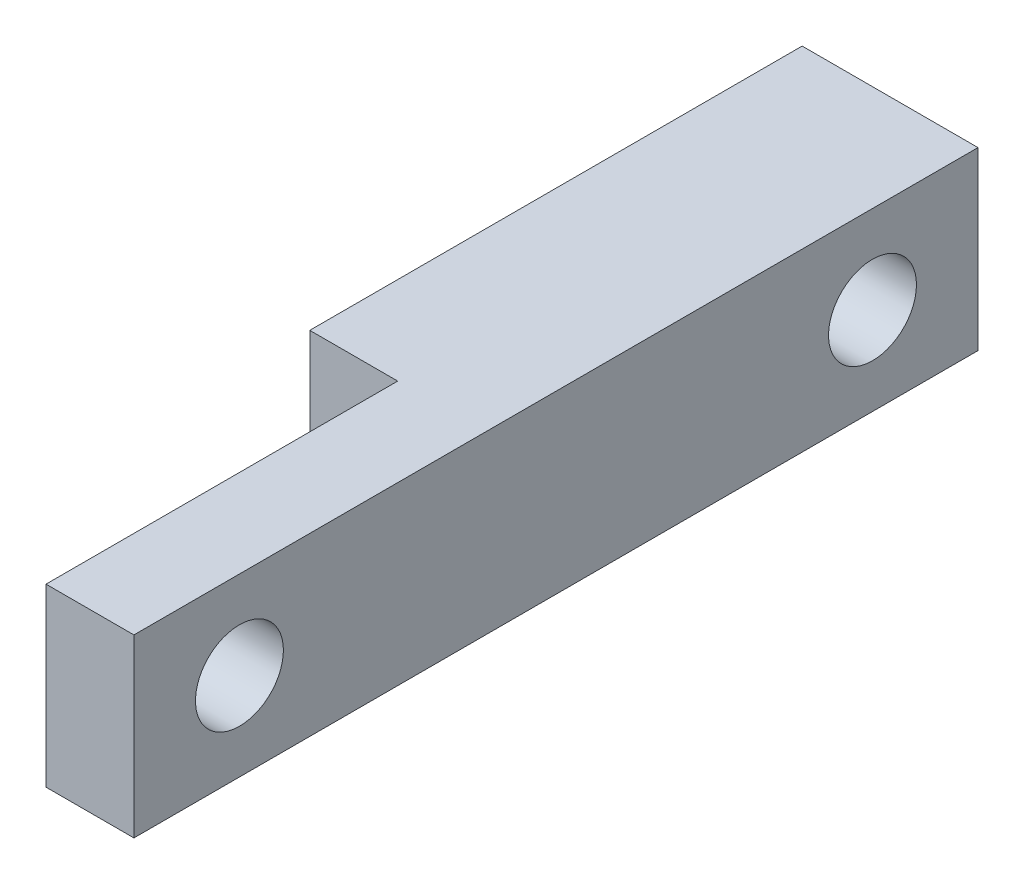
ISO-10303-21;
HEADER;
FILE_DESCRIPTION(('STEP AP214'),'2;1');
FILE_NAME('part.step','',(''),(''),'','','');
FILE_SCHEMA(('AUTOMOTIVE_DESIGN { 1 0 10303 214 1 1 1 1 }'));
ENDSEC;
DATA;
#1=APPLICATION_CONTEXT('core data for automotive mechanical design processes');
#2=APPLICATION_PROTOCOL_DEFINITION('international standard','automotive_design',2000,#1);
#3=PRODUCT_CONTEXT('',#1,'mechanical');
#4=PRODUCT('Part','Part','',(#3));
#5=PRODUCT_RELATED_PRODUCT_CATEGORY('part','',(#4));
#6=PRODUCT_DEFINITION_FORMATION('','',#4);
#7=PRODUCT_DEFINITION_CONTEXT('part definition',#1,'design');
#8=PRODUCT_DEFINITION('design','',#6,#7);
#9=PRODUCT_DEFINITION_SHAPE('','',#8);
#10=(LENGTH_UNIT() NAMED_UNIT(*) SI_UNIT(.MILLI.,.METRE.));
#11=(NAMED_UNIT(*) PLANE_ANGLE_UNIT() SI_UNIT($,.RADIAN.));
#12=(NAMED_UNIT(*) SI_UNIT($,.STERADIAN.) SOLID_ANGLE_UNIT());
#13=UNCERTAINTY_MEASURE_WITH_UNIT(LENGTH_MEASURE(1.E-05),#10,'distance_accuracy_value','');
#14=(GEOMETRIC_REPRESENTATION_CONTEXT(3) GLOBAL_UNCERTAINTY_ASSIGNED_CONTEXT((#13)) GLOBAL_UNIT_ASSIGNED_CONTEXT((#10,
#11,#12)) REPRESENTATION_CONTEXT('',''));
#15=CARTESIAN_POINT('',(0.,0.,0.));
#16=DIRECTION('',(0.,0.,1.));
#17=DIRECTION('',(1.,0.,0.));
#18=AXIS2_PLACEMENT_3D('',#15,#16,#17);
#19=CARTESIAN_POINT('',(6.35,0.,0.));
#20=DIRECTION('',(0.,0.,-1.));
#21=DIRECTION('',(-1.,0.,0.));
#22=AXIS2_PLACEMENT_3D('',#19,#20,#21);
#23=PLANE('',#22);
#24=DIRECTION('',(-1.,0.,0.));
#25=VECTOR('',#24,1.);
#26=CARTESIAN_POINT('',(6.35,6.35,0.));
#27=LINE('',#26,#25);
#28=CARTESIAN_POINT('',(6.35,6.35,0.));
#29=VERTEX_POINT('',#28);
#30=CARTESIAN_POINT('',(3.175,6.35,0.));
#31=VERTEX_POINT('',#30);
#32=EDGE_CURVE('E112',#29,#31,#27,.T.);
#33=ORIENTED_EDGE('',*,*,#32,.T.);
#34=DIRECTION('',(0.,1.,0.));
#35=VECTOR('',#34,1.);
#36=CARTESIAN_POINT('',(3.175,6.35,0.));
#37=LINE('',#36,#35);
#38=CARTESIAN_POINT('',(3.175,0.,0.));
#39=VERTEX_POINT('',#38);
#40=EDGE_CURVE('E96',#39,#31,#37,.T.);
#41=ORIENTED_EDGE('',*,*,#40,.F.);
#42=DIRECTION('',(-1.,0.,0.));
#43=VECTOR('',#42,1.);
#44=CARTESIAN_POINT('',(6.35,0.,0.));
#45=LINE('',#44,#43);
#46=CARTESIAN_POINT('',(6.35,0.,0.));
#47=VERTEX_POINT('',#46);
#48=EDGE_CURVE('E11',#47,#39,#45,.T.);
#49=ORIENTED_EDGE('',*,*,#48,.F.);
#50=DIRECTION('',(0.,-1.,0.));
#51=VECTOR('',#50,1.);
#52=CARTESIAN_POINT('',(6.35,0.,0.));
#53=LINE('',#52,#51);
#54=EDGE_CURVE('E116',#29,#47,#53,.T.);
#55=ORIENTED_EDGE('',*,*,#54,.F.);
#56=EDGE_LOOP('',(#33,#41,#49,#55));
#57=FACE_BOUND('',#56,.T.);
#58=ADVANCED_FACE('F33',(#57),#23,.F.);
#59=CARTESIAN_POINT('',(6.35,0.,0.));
#60=DIRECTION('',(0.,1.,0.));
#61=DIRECTION('',(0.,0.,1.));
#62=AXIS2_PLACEMENT_3D('',#59,#60,#61);
#63=PLANE('',#62);
#64=DIRECTION('',(0.,0.,1.));
#65=VECTOR('',#64,1.);
#66=CARTESIAN_POINT('',(3.175,0.,0.));
#67=LINE('',#66,#65);
#68=CARTESIAN_POINT('',(3.175,0.,-12.7));
#69=VERTEX_POINT('',#68);
#70=EDGE_CURVE('E103',#69,#39,#67,.T.);
#71=ORIENTED_EDGE('',*,*,#70,.F.);
#72=DIRECTION('',(-1.,0.,0.));
#73=VECTOR('',#72,1.);
#74=CARTESIAN_POINT('',(3.175,0.,-12.7));
#75=LINE('',#74,#73);
#76=CARTESIAN_POINT('',(0.,0.,-12.7));
#77=VERTEX_POINT('',#76);
#78=EDGE_CURVE('E142',#69,#77,#75,.T.);
#79=ORIENTED_EDGE('',*,*,#78,.T.);
#80=DIRECTION('',(0.,0.,-1.));
#81=VECTOR('',#80,1.);
#82=CARTESIAN_POINT('',(0.,0.,0.));
#83=LINE('',#82,#81);
#84=CARTESIAN_POINT('',(0.,0.,-30.48));
#85=VERTEX_POINT('',#84);
#86=EDGE_CURVE('E132',#77,#85,#83,.T.);
#87=ORIENTED_EDGE('',*,*,#86,.T.);
#88=DIRECTION('',(-1.,0.,0.));
#89=VECTOR('',#88,1.);
#90=CARTESIAN_POINT('',(6.35,0.,-30.48));
#91=LINE('',#90,#89);
#92=CARTESIAN_POINT('',(6.35,0.,-30.48));
#93=VERTEX_POINT('',#92);
#94=EDGE_CURVE('E41',#93,#85,#91,.T.);
#95=ORIENTED_EDGE('',*,*,#94,.F.);
#96=DIRECTION('',(0.,0.,-1.));
#97=VECTOR('',#96,1.);
#98=CARTESIAN_POINT('',(6.35,0.,0.));
#99=LINE('',#98,#97);
#100=EDGE_CURVE('E80',#47,#93,#99,.T.);
#101=ORIENTED_EDGE('',*,*,#100,.F.);
#102=ORIENTED_EDGE('',*,*,#48,.T.);
#103=EDGE_LOOP('',(#71,#79,#87,#95,#101,#102));
#104=FACE_BOUND('',#103,.T.);
#105=ADVANCED_FACE('F162',(#104),#63,.F.);
#106=CARTESIAN_POINT('',(6.35,0.,-30.48));
#107=DIRECTION('',(0.,0.,1.));
#108=DIRECTION('',(1.,0.,0.));
#109=AXIS2_PLACEMENT_3D('',#106,#107,#108);
#110=PLANE('',#109);
#111=DIRECTION('',(0.,1.,0.));
#112=VECTOR('',#111,1.);
#113=CARTESIAN_POINT('',(0.,0.,-30.48));
#114=LINE('',#113,#112);
#115=CARTESIAN_POINT('',(0.,6.35,-30.48));
#116=VERTEX_POINT('',#115);
#117=EDGE_CURVE('E73',#85,#116,#114,.T.);
#118=ORIENTED_EDGE('',*,*,#117,.T.);
#119=DIRECTION('',(-1.,0.,0.));
#120=VECTOR('',#119,1.);
#121=CARTESIAN_POINT('',(6.35,6.35,-30.48));
#122=LINE('',#121,#120);
#123=CARTESIAN_POINT('',(6.35,6.35,-30.48));
#124=VERTEX_POINT('',#123);
#125=EDGE_CURVE('E117',#124,#116,#122,.T.);
#126=ORIENTED_EDGE('',*,*,#125,.F.);
#127=DIRECTION('',(0.,1.,0.));
#128=VECTOR('',#127,1.);
#129=CARTESIAN_POINT('',(6.35,0.,-30.48));
#130=LINE('',#129,#128);
#131=EDGE_CURVE('E120',#93,#124,#130,.T.);
#132=ORIENTED_EDGE('',*,*,#131,.F.);
#133=ORIENTED_EDGE('',*,*,#94,.T.);
#134=EDGE_LOOP('',(#118,#126,#132,#133));
#135=FACE_BOUND('',#134,.T.);
#136=ADVANCED_FACE('F127',(#135),#110,.F.);
#137=CARTESIAN_POINT('',(6.35,6.35,0.));
#138=DIRECTION('',(0.,-1.,0.));
#139=DIRECTION('',(0.,0.,-1.));
#140=AXIS2_PLACEMENT_3D('',#137,#138,#139);
#141=PLANE('',#140);
#142=DIRECTION('',(0.,0.,1.));
#143=VECTOR('',#142,1.);
#144=CARTESIAN_POINT('',(0.,6.35,0.));
#145=LINE('',#144,#143);
#146=CARTESIAN_POINT('',(0.,6.35,-12.7));
#147=VERTEX_POINT('',#146);
#148=EDGE_CURVE('E123',#116,#147,#145,.T.);
#149=ORIENTED_EDGE('',*,*,#148,.T.);
#150=DIRECTION('',(-1.,0.,0.));
#151=VECTOR('',#150,1.);
#152=CARTESIAN_POINT('',(3.175,6.35,-12.7));
#153=LINE('',#152,#151);
#154=CARTESIAN_POINT('',(3.175,6.35,-12.7));
#155=VERTEX_POINT('',#154);
#156=EDGE_CURVE('E48',#155,#147,#153,.T.);
#157=ORIENTED_EDGE('',*,*,#156,.F.);
#158=DIRECTION('',(0.,0.,-1.));
#159=VECTOR('',#158,1.);
#160=CARTESIAN_POINT('',(3.175,6.35,0.));
#161=LINE('',#160,#159);
#162=EDGE_CURVE('E101',#31,#155,#161,.T.);
#163=ORIENTED_EDGE('',*,*,#162,.F.);
#164=ORIENTED_EDGE('',*,*,#32,.F.);
#165=DIRECTION('',(0.,0.,1.));
#166=VECTOR('',#165,1.);
#167=CARTESIAN_POINT('',(6.35,6.35,0.));
#168=LINE('',#167,#166);
#169=EDGE_CURVE('E57',#124,#29,#168,.T.);
#170=ORIENTED_EDGE('',*,*,#169,.F.);
#171=ORIENTED_EDGE('',*,*,#125,.T.);
#172=EDGE_LOOP('',(#149,#157,#163,#164,#170,#171));
#173=FACE_BOUND('',#172,.T.);
#174=ADVANCED_FACE('F111',(#173),#141,.F.);
#175=CARTESIAN_POINT('',(6.35,0.,0.));
#176=DIRECTION('',(-1.,0.,0.));
#177=DIRECTION('',(0.,0.,1.));
#178=AXIS2_PLACEMENT_3D('',#175,#176,#177);
#179=PLANE('',#178);
#180=CARTESIAN_POINT('',(6.35,3.175,-26.67));
#181=DIRECTION('',(1.,0.,0.));
#182=DIRECTION('',(0.,0.,-1.));
#183=AXIS2_PLACEMENT_3D('',#180,#181,#182);
#184=CIRCLE('',#183,1.58749999999999);
#185=CARTESIAN_POINT('',(6.35,3.175,-28.2575));
#186=VERTEX_POINT('',#185);
#187=EDGE_CURVE('E151',#186,#186,#184,.T.);
#188=ORIENTED_EDGE('',*,*,#187,.F.);
#189=EDGE_LOOP('',(#188));
#190=FACE_BOUND('',#189,.T.);
#191=CARTESIAN_POINT('',(6.35,3.175,-3.81));
#192=DIRECTION('',(1.,0.,0.));
#193=DIRECTION('',(0.,0.,-1.));
#194=AXIS2_PLACEMENT_3D('',#191,#192,#193);
#195=CIRCLE('',#194,1.58749999999999);
#196=CARTESIAN_POINT('',(6.35,3.175,-5.39749999999999));
#197=VERTEX_POINT('',#196);
#198=EDGE_CURVE('E133',#197,#197,#195,.T.);
#199=ORIENTED_EDGE('',*,*,#198,.F.);
#200=EDGE_LOOP('',(#199));
#201=FACE_BOUND('',#200,.T.);
#202=ORIENTED_EDGE('',*,*,#54,.T.);
#203=ORIENTED_EDGE('',*,*,#100,.T.);
#204=ORIENTED_EDGE('',*,*,#131,.T.);
#205=ORIENTED_EDGE('',*,*,#169,.T.);
#206=EDGE_LOOP('',(#202,#203,#204,#205));
#207=FACE_BOUND('',#206,.T.);
#208=ADVANCED_FACE('F157',(#190,#201,#207),#179,.F.);
#209=CARTESIAN_POINT('',(0.,0.,0.));
#210=DIRECTION('',(-1.,0.,0.));
#211=DIRECTION('',(0.,0.,1.));
#212=AXIS2_PLACEMENT_3D('',#209,#210,#211);
#213=PLANE('',#212);
#214=CARTESIAN_POINT('',(0.,3.175,-26.67));
#215=DIRECTION('',(-1.,0.,0.));
#216=DIRECTION('',(0.,0.,1.));
#217=AXIS2_PLACEMENT_3D('',#214,#215,#216);
#218=CIRCLE('',#217,1.58749999999999);
#219=CARTESIAN_POINT('',(0.,3.175,-25.0825));
#220=VERTEX_POINT('',#219);
#221=EDGE_CURVE('E146',#220,#220,#218,.T.);
#222=ORIENTED_EDGE('',*,*,#221,.F.);
#223=EDGE_LOOP('',(#222));
#224=FACE_BOUND('',#223,.T.);
#225=DIRECTION('',(0.,-1.,0.));
#226=VECTOR('',#225,1.);
#227=CARTESIAN_POINT('',(0.,6.35,-12.7));
#228=LINE('',#227,#226);
#229=EDGE_CURVE('E107',#147,#77,#228,.T.);
#230=ORIENTED_EDGE('',*,*,#229,.F.);
#231=ORIENTED_EDGE('',*,*,#148,.F.);
#232=ORIENTED_EDGE('',*,*,#117,.F.);
#233=ORIENTED_EDGE('',*,*,#86,.F.);
#234=EDGE_LOOP('',(#230,#231,#232,#233));
#235=FACE_BOUND('',#234,.T.);
#236=ADVANCED_FACE('F131',(#224,#235),#213,.T.);
#237=CARTESIAN_POINT('',(6.35,3.175,-3.81));
#238=DIRECTION('',(1.,0.,0.));
#239=DIRECTION('',(0.,0.,-1.));
#240=AXIS2_PLACEMENT_3D('',#237,#238,#239);
#241=CYLINDRICAL_SURFACE('',#240,1.58749999999999);
#242=CARTESIAN_POINT('',(3.175,3.175,-3.81));
#243=DIRECTION('',(1.,0.,0.));
#244=DIRECTION('',(0.,0.,-1.));
#245=AXIS2_PLACEMENT_3D('',#242,#243,#244);
#246=CIRCLE('',#245,1.58749999999999);
#247=CARTESIAN_POINT('',(3.175,3.175,-5.39749999999999));
#248=VERTEX_POINT('',#247);
#249=EDGE_CURVE('E36',#248,#248,#246,.F.);
#250=ORIENTED_EDGE('',*,*,#249,.T.);
#251=EDGE_LOOP('',(#250));
#252=FACE_BOUND('',#251,.T.);
#253=ORIENTED_EDGE('',*,*,#198,.T.);
#254=EDGE_LOOP('',(#253));
#255=FACE_BOUND('',#254,.T.);
#256=ADVANCED_FACE('F172',(#252,#255),#241,.F.);
#257=CARTESIAN_POINT('',(3.175,0.,0.));
#258=DIRECTION('',(1.,0.,0.));
#259=DIRECTION('',(0.,0.,-1.));
#260=AXIS2_PLACEMENT_3D('',#257,#258,#259);
#261=PLANE('',#260);
#262=ORIENTED_EDGE('',*,*,#40,.T.);
#263=ORIENTED_EDGE('',*,*,#162,.T.);
#264=DIRECTION('',(0.,-1.,0.));
#265=VECTOR('',#264,1.);
#266=CARTESIAN_POINT('',(3.175,6.35,-12.7));
#267=LINE('',#266,#265);
#268=EDGE_CURVE('E114',#155,#69,#267,.T.);
#269=ORIENTED_EDGE('',*,*,#268,.T.);
#270=ORIENTED_EDGE('',*,*,#70,.T.);
#271=EDGE_LOOP('',(#262,#263,#269,#270));
#272=FACE_BOUND('',#271,.T.);
#273=ORIENTED_EDGE('',*,*,#249,.F.);
#274=EDGE_LOOP('',(#273));
#275=FACE_BOUND('',#274,.T.);
#276=ADVANCED_FACE('F98',(#272,#275),#261,.F.);
#277=CARTESIAN_POINT('',(3.175,6.35,-12.7));
#278=DIRECTION('',(0.,0.,-1.));
#279=DIRECTION('',(-1.,0.,0.));
#280=AXIS2_PLACEMENT_3D('',#277,#278,#279);
#281=PLANE('',#280);
#282=ORIENTED_EDGE('',*,*,#229,.T.);
#283=ORIENTED_EDGE('',*,*,#78,.F.);
#284=ORIENTED_EDGE('',*,*,#268,.F.);
#285=ORIENTED_EDGE('',*,*,#156,.T.);
#286=EDGE_LOOP('',(#282,#283,#284,#285));
#287=FACE_BOUND('',#286,.T.);
#288=ADVANCED_FACE('F163',(#287),#281,.F.);
#289=CARTESIAN_POINT('',(6.35,3.175,-26.67));
#290=DIRECTION('',(1.,0.,0.));
#291=DIRECTION('',(0.,0.,-1.));
#292=AXIS2_PLACEMENT_3D('',#289,#290,#291);
#293=CYLINDRICAL_SURFACE('',#292,1.58749999999999);
#294=ORIENTED_EDGE('',*,*,#221,.T.);
#295=EDGE_LOOP('',(#294));
#296=FACE_BOUND('',#295,.T.);
#297=ORIENTED_EDGE('',*,*,#187,.T.);
#298=EDGE_LOOP('',(#297));
#299=FACE_BOUND('',#298,.T.);
#300=ADVANCED_FACE('F155',(#296,#299),#293,.F.);
#301=CLOSED_SHELL('',(#58,#105,#136,#174,#208,#236,#256,#276,#288,#300));
#302=MANIFOLD_SOLID_BREP('B2',#301);
#303=ADVANCED_BREP_SHAPE_REPRESENTATION('',(#18,#302),#14);
#304=SHAPE_DEFINITION_REPRESENTATION(#9,#303);
ENDSEC;
END-ISO-10303-21;
